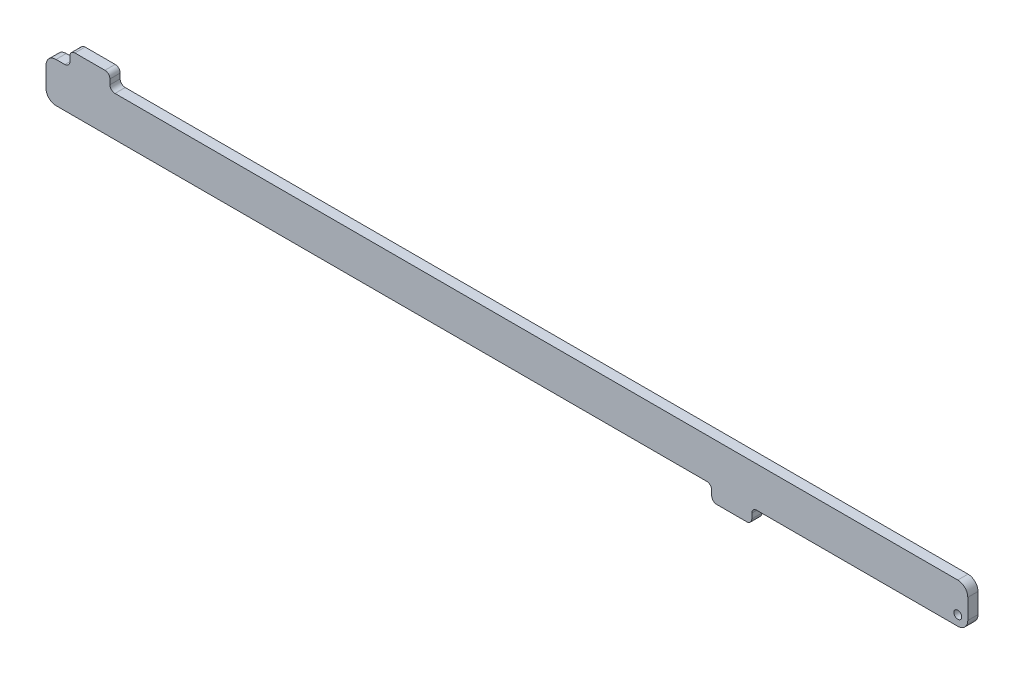
ISO-10303-21;
HEADER;
FILE_DESCRIPTION(('STEP AP214'),'2;1');
FILE_NAME('part.step','',(''),(''),'','','');
FILE_SCHEMA(('AUTOMOTIVE_DESIGN { 1 0 10303 214 1 1 1 1 }'));
ENDSEC;
DATA;
#1=APPLICATION_CONTEXT('core data for automotive mechanical design processes');
#2=APPLICATION_PROTOCOL_DEFINITION('international standard','automotive_design',2000,#1);
#3=PRODUCT_CONTEXT('',#1,'mechanical');
#4=PRODUCT('Part','Part','',(#3));
#5=PRODUCT_RELATED_PRODUCT_CATEGORY('part','',(#4));
#6=PRODUCT_DEFINITION_FORMATION('','',#4);
#7=PRODUCT_DEFINITION_CONTEXT('part definition',#1,'design');
#8=PRODUCT_DEFINITION('design','',#6,#7);
#9=PRODUCT_DEFINITION_SHAPE('','',#8);
#10=(LENGTH_UNIT() NAMED_UNIT(*) SI_UNIT(.MILLI.,.METRE.));
#11=(NAMED_UNIT(*) PLANE_ANGLE_UNIT() SI_UNIT($,.RADIAN.));
#12=(NAMED_UNIT(*) SI_UNIT($,.STERADIAN.) SOLID_ANGLE_UNIT());
#13=UNCERTAINTY_MEASURE_WITH_UNIT(LENGTH_MEASURE(1.E-05),#10,'distance_accuracy_value','');
#14=(GEOMETRIC_REPRESENTATION_CONTEXT(3) GLOBAL_UNCERTAINTY_ASSIGNED_CONTEXT((#13)) GLOBAL_UNIT_ASSIGNED_CONTEXT((#10,
#11,#12)) REPRESENTATION_CONTEXT('',''));
#15=CARTESIAN_POINT('',(0.,0.,0.));
#16=DIRECTION('',(0.,0.,1.));
#17=DIRECTION('',(1.,0.,0.));
#18=AXIS2_PLACEMENT_3D('',#15,#16,#17);
#19=CARTESIAN_POINT('',(447.303292844,0.,-6.477));
#20=DIRECTION('',(-1.,0.,0.));
#21=DIRECTION('',(0.,0.,-1.));
#22=AXIS2_PLACEMENT_3D('',#19,#20,#21);
#23=PLANE('',#22);
#24=DIRECTION('',(0.,1.,0.));
#25=VECTOR('',#24,1.);
#26=CARTESIAN_POINT('',(447.303292844,0.,-6.477));
#27=LINE('',#26,#25);
#28=CARTESIAN_POINT('',(447.303292844,-6.35,-6.477));
#29=VERTEX_POINT('',#28);
#30=CARTESIAN_POINT('',(447.303292844,-3.175,-6.477));
#31=VERTEX_POINT('',#30);
#32=EDGE_CURVE('E485',#29,#31,#27,.T.);
#33=ORIENTED_EDGE('',*,*,#32,.T.);
#34=DIRECTION('',(0.,0.,1.));
#35=VECTOR('',#34,1.);
#36=CARTESIAN_POINT('',(447.303292844,-3.175,0.));
#37=LINE('',#36,#35);
#38=CARTESIAN_POINT('',(447.303292844,-3.175,0.));
#39=VERTEX_POINT('',#38);
#40=EDGE_CURVE('E329',#31,#39,#37,.T.);
#41=ORIENTED_EDGE('',*,*,#40,.T.);
#42=DIRECTION('',(0.,1.,0.));
#43=VECTOR('',#42,1.);
#44=CARTESIAN_POINT('',(447.303292844,0.,0.));
#45=LINE('',#44,#43);
#46=CARTESIAN_POINT('',(447.303292844,-6.35,0.));
#47=VERTEX_POINT('',#46);
#48=EDGE_CURVE('E248',#47,#39,#45,.T.);
#49=ORIENTED_EDGE('',*,*,#48,.F.);
#50=DIRECTION('',(0.,0.,1.));
#51=VECTOR('',#50,1.);
#52=CARTESIAN_POINT('',(447.303292844,-6.35,-6.477));
#53=LINE('',#52,#51);
#54=EDGE_CURVE('E326',#47,#29,#53,.F.);
#55=ORIENTED_EDGE('',*,*,#54,.T.);
#56=EDGE_LOOP('',(#33,#41,#49,#55));
#57=FACE_BOUND('',#56,.T.);
#58=ADVANCED_FACE('F47',(#57),#23,.F.);
#59=CARTESIAN_POINT('',(0.,0.,-6.477));
#60=DIRECTION('',(0.,1.,0.));
#61=DIRECTION('',(0.,0.,-1.));
#62=AXIS2_PLACEMENT_3D('',#59,#60,#61);
#63=PLANE('',#62);
#64=DIRECTION('',(1.,0.,0.));
#65=VECTOR('',#64,1.);
#66=CARTESIAN_POINT('',(0.,0.,0.));
#67=LINE('',#66,#65);
#68=CARTESIAN_POINT('',(450.478292844,0.,0.));
#69=VERTEX_POINT('',#68);
#70=CARTESIAN_POINT('',(577.85,0.,0.));
#71=VERTEX_POINT('',#70);
#72=EDGE_CURVE('E219',#69,#71,#67,.T.);
#73=ORIENTED_EDGE('',*,*,#72,.F.);
#74=DIRECTION('',(0.,0.,1.));
#75=VECTOR('',#74,1.);
#76=CARTESIAN_POINT('',(450.478292844,0.,-6.477));
#77=LINE('',#76,#75);
#78=CARTESIAN_POINT('',(450.478292844,0.,-6.477));
#79=VERTEX_POINT('',#78);
#80=EDGE_CURVE('E333',#69,#79,#77,.F.);
#81=ORIENTED_EDGE('',*,*,#80,.T.);
#82=DIRECTION('',(1.,0.,0.));
#83=VECTOR('',#82,1.);
#84=CARTESIAN_POINT('',(0.,0.,-6.477));
#85=LINE('',#84,#83);
#86=CARTESIAN_POINT('',(577.85,0.,-6.477));
#87=VERTEX_POINT('',#86);
#88=EDGE_CURVE('E590',#79,#87,#85,.T.);
#89=ORIENTED_EDGE('',*,*,#88,.T.);
#90=DIRECTION('',(0.,0.,1.));
#91=VECTOR('',#90,1.);
#92=CARTESIAN_POINT('',(577.85,0.,-6.477));
#93=LINE('',#92,#91);
#94=EDGE_CURVE('E224',#71,#87,#93,.F.);
#95=ORIENTED_EDGE('',*,*,#94,.F.);
#96=EDGE_LOOP('',(#73,#81,#89,#95));
#97=FACE_BOUND('',#96,.T.);
#98=ADVANCED_FACE('F529',(#97),#63,.F.);
#99=CARTESIAN_POINT('',(584.2,0.,-6.477));
#100=DIRECTION('',(-1.,0.,0.));
#101=DIRECTION('',(0.,0.,-1.));
#102=AXIS2_PLACEMENT_3D('',#99,#100,#101);
#103=PLANE('',#102);
#104=DIRECTION('',(0.,1.,0.));
#105=VECTOR('',#104,1.);
#106=CARTESIAN_POINT('',(584.2,0.,-6.477));
#107=LINE('',#106,#105);
#108=CARTESIAN_POINT('',(584.2,6.35,-6.477));
#109=VERTEX_POINT('',#108);
#110=CARTESIAN_POINT('',(584.2,19.05,-6.477));
#111=VERTEX_POINT('',#110);
#112=EDGE_CURVE('E585',#109,#111,#107,.T.);
#113=ORIENTED_EDGE('',*,*,#112,.T.);
#114=DIRECTION('',(0.,0.,1.));
#115=VECTOR('',#114,1.);
#116=CARTESIAN_POINT('',(584.2,19.05,-6.477));
#117=LINE('',#116,#115);
#118=CARTESIAN_POINT('',(584.2,19.05,0.));
#119=VERTEX_POINT('',#118);
#120=EDGE_CURVE('E237',#119,#111,#117,.F.);
#121=ORIENTED_EDGE('',*,*,#120,.F.);
#122=DIRECTION('',(0.,1.,0.));
#123=VECTOR('',#122,1.);
#124=CARTESIAN_POINT('',(584.2,0.,0.));
#125=LINE('',#124,#123);
#126=CARTESIAN_POINT('',(584.2,6.35,0.));
#127=VERTEX_POINT('',#126);
#128=EDGE_CURVE('E216',#127,#119,#125,.T.);
#129=ORIENTED_EDGE('',*,*,#128,.F.);
#130=DIRECTION('',(0.,0.,1.));
#131=VECTOR('',#130,1.);
#132=CARTESIAN_POINT('',(584.2,6.35,-6.477));
#133=LINE('',#132,#131);
#134=EDGE_CURVE('E228',#109,#127,#133,.T.);
#135=ORIENTED_EDGE('',*,*,#134,.F.);
#136=EDGE_LOOP('',(#113,#121,#129,#135));
#137=FACE_BOUND('',#136,.T.);
#138=ADVANCED_FACE('F239',(#137),#103,.F.);
#139=CARTESIAN_POINT('',(0.,25.4,-6.477));
#140=DIRECTION('',(0.,1.,0.));
#141=DIRECTION('',(0.,0.,-1.));
#142=AXIS2_PLACEMENT_3D('',#139,#140,#141);
#143=PLANE('',#142);
#144=DIRECTION('',(1.,0.,0.));
#145=VECTOR('',#144,1.);
#146=CARTESIAN_POINT('',(0.,25.4,-6.477));
#147=LINE('',#146,#145);
#148=CARTESIAN_POINT('',(43.705665192,25.4,-6.477));
#149=VERTEX_POINT('',#148);
#150=CARTESIAN_POINT('',(577.85,25.4,-6.477));
#151=VERTEX_POINT('',#150);
#152=EDGE_CURVE('E551',#149,#151,#147,.T.);
#153=ORIENTED_EDGE('',*,*,#152,.F.);
#154=DIRECTION('',(0.,0.,1.));
#155=VECTOR('',#154,1.);
#156=CARTESIAN_POINT('',(43.705665192,25.4,0.));
#157=LINE('',#156,#155);
#158=CARTESIAN_POINT('',(43.705665192,25.4,0.));
#159=VERTEX_POINT('',#158);
#160=EDGE_CURVE('E378',#149,#159,#157,.T.);
#161=ORIENTED_EDGE('',*,*,#160,.T.);
#162=DIRECTION('',(1.,0.,0.));
#163=VECTOR('',#162,1.);
#164=CARTESIAN_POINT('',(0.,25.4,0.));
#165=LINE('',#164,#163);
#166=CARTESIAN_POINT('',(577.85,25.4,0.));
#167=VERTEX_POINT('',#166);
#168=EDGE_CURVE('E242',#159,#167,#165,.T.);
#169=ORIENTED_EDGE('',*,*,#168,.T.);
#170=DIRECTION('',(0.,0.,1.));
#171=VECTOR('',#170,1.);
#172=CARTESIAN_POINT('',(577.85,25.4,0.));
#173=LINE('',#172,#171);
#174=EDGE_CURVE('E306',#151,#167,#173,.T.);
#175=ORIENTED_EDGE('',*,*,#174,.F.);
#176=EDGE_LOOP('',(#153,#161,#169,#175));
#177=FACE_BOUND('',#176,.T.);
#178=ADVANCED_FACE('F550',(#177),#143,.T.);
#179=CARTESIAN_POINT('',(40.530665192,0.,-6.477));
#180=DIRECTION('',(1.,0.,0.));
#181=DIRECTION('',(0.,0.,1.));
#182=AXIS2_PLACEMENT_3D('',#179,#180,#181);
#183=PLANE('',#182);
#184=DIRECTION('',(0.,-1.,0.));
#185=VECTOR('',#184,1.);
#186=CARTESIAN_POINT('',(40.530665192,0.,0.));
#187=LINE('',#186,#185);
#188=CARTESIAN_POINT('',(40.530665192,31.75,0.));
#189=VERTEX_POINT('',#188);
#190=CARTESIAN_POINT('',(40.530665192,28.575,0.));
#191=VERTEX_POINT('',#190);
#192=EDGE_CURVE('E246',#189,#191,#187,.T.);
#193=ORIENTED_EDGE('',*,*,#192,.T.);
#194=DIRECTION('',(0.,0.,1.));
#195=VECTOR('',#194,1.);
#196=CARTESIAN_POINT('',(40.530665192,28.575,-6.477));
#197=LINE('',#196,#195);
#198=CARTESIAN_POINT('',(40.530665192,28.575,-6.477));
#199=VERTEX_POINT('',#198);
#200=EDGE_CURVE('E71',#191,#199,#197,.F.);
#201=ORIENTED_EDGE('',*,*,#200,.T.);
#202=DIRECTION('',(0.,-1.,0.));
#203=VECTOR('',#202,1.);
#204=CARTESIAN_POINT('',(40.530665192,0.,-6.477));
#205=LINE('',#204,#203);
#206=CARTESIAN_POINT('',(40.530665192,31.75,-6.477));
#207=VERTEX_POINT('',#206);
#208=EDGE_CURVE('E451',#207,#199,#205,.T.);
#209=ORIENTED_EDGE('',*,*,#208,.F.);
#210=DIRECTION('',(0.,0.,1.));
#211=VECTOR('',#210,1.);
#212=CARTESIAN_POINT('',(40.530665192,31.75,-6.477));
#213=LINE('',#212,#211);
#214=EDGE_CURVE('E382',#207,#189,#213,.T.);
#215=ORIENTED_EDGE('',*,*,#214,.T.);
#216=EDGE_LOOP('',(#193,#201,#209,#215));
#217=FACE_BOUND('',#216,.T.);
#218=ADVANCED_FACE('F556',(#217),#183,.T.);
#219=CARTESIAN_POINT('',(0.,34.925,-6.477));
#220=DIRECTION('',(0.,1.,0.));
#221=DIRECTION('',(0.,0.,-1.));
#222=AXIS2_PLACEMENT_3D('',#219,#220,#221);
#223=PLANE('',#222);
#224=DIRECTION('',(1.,0.,0.));
#225=VECTOR('',#224,1.);
#226=CARTESIAN_POINT('',(0.,34.925,0.));
#227=LINE('',#226,#225);
#228=CARTESIAN_POINT('',(18.305665192,34.925,0.));
#229=VERTEX_POINT('',#228);
#230=CARTESIAN_POINT('',(37.355665192,34.925,0.));
#231=VERTEX_POINT('',#230);
#232=EDGE_CURVE('E254',#229,#231,#227,.T.);
#233=ORIENTED_EDGE('',*,*,#232,.T.);
#234=DIRECTION('',(0.,0.,1.));
#235=VECTOR('',#234,1.);
#236=CARTESIAN_POINT('',(37.355665192,34.925,-6.477));
#237=LINE('',#236,#235);
#238=CARTESIAN_POINT('',(37.355665192,34.925,-6.477));
#239=VERTEX_POINT('',#238);
#240=EDGE_CURVE('E392',#231,#239,#237,.F.);
#241=ORIENTED_EDGE('',*,*,#240,.T.);
#242=DIRECTION('',(1.,0.,0.));
#243=VECTOR('',#242,1.);
#244=CARTESIAN_POINT('',(0.,34.925,-6.477));
#245=LINE('',#244,#243);
#246=CARTESIAN_POINT('',(18.305665192,34.925,-6.477));
#247=VERTEX_POINT('',#246);
#248=EDGE_CURVE('E444',#247,#239,#245,.T.);
#249=ORIENTED_EDGE('',*,*,#248,.F.);
#250=DIRECTION('',(0.,0.,1.));
#251=VECTOR('',#250,1.);
#252=CARTESIAN_POINT('',(18.305665192,34.925,0.));
#253=LINE('',#252,#251);
#254=EDGE_CURVE('E388',#247,#229,#253,.T.);
#255=ORIENTED_EDGE('',*,*,#254,.T.);
#256=EDGE_LOOP('',(#233,#241,#249,#255));
#257=FACE_BOUND('',#256,.T.);
#258=ADVANCED_FACE('F580',(#257),#223,.T.);
#259=CARTESIAN_POINT('',(15.130665192,0.,-6.477));
#260=DIRECTION('',(1.,0.,0.));
#261=DIRECTION('',(0.,0.,1.));
#262=AXIS2_PLACEMENT_3D('',#259,#260,#261);
#263=PLANE('',#262);
#264=DIRECTION('',(0.,-1.,0.));
#265=VECTOR('',#264,1.);
#266=CARTESIAN_POINT('',(15.130665192,0.,0.));
#267=LINE('',#266,#265);
#268=CARTESIAN_POINT('',(15.130665192,31.75,0.));
#269=VERTEX_POINT('',#268);
#270=CARTESIAN_POINT('',(15.130665192,28.575,0.));
#271=VERTEX_POINT('',#270);
#272=EDGE_CURVE('E258',#269,#271,#267,.T.);
#273=ORIENTED_EDGE('',*,*,#272,.F.);
#274=DIRECTION('',(0.,0.,1.));
#275=VECTOR('',#274,1.);
#276=CARTESIAN_POINT('',(15.130665192,31.75,-6.477));
#277=LINE('',#276,#275);
#278=CARTESIAN_POINT('',(15.130665192,31.75,-6.477));
#279=VERTEX_POINT('',#278);
#280=EDGE_CURVE('E399',#269,#279,#277,.F.);
#281=ORIENTED_EDGE('',*,*,#280,.T.);
#282=DIRECTION('',(0.,-1.,0.));
#283=VECTOR('',#282,1.);
#284=CARTESIAN_POINT('',(15.130665192,0.,-6.477));
#285=LINE('',#284,#283);
#286=CARTESIAN_POINT('',(15.130665192,28.575,-6.477));
#287=VERTEX_POINT('',#286);
#288=EDGE_CURVE('E437',#279,#287,#285,.T.);
#289=ORIENTED_EDGE('',*,*,#288,.T.);
#290=DIRECTION('',(0.,0.,1.));
#291=VECTOR('',#290,1.);
#292=CARTESIAN_POINT('',(15.130665192,28.575,-6.477));
#293=LINE('',#292,#291);
#294=EDGE_CURVE('E395',#287,#271,#293,.T.);
#295=ORIENTED_EDGE('',*,*,#294,.T.);
#296=EDGE_LOOP('',(#273,#281,#289,#295));
#297=FACE_BOUND('',#296,.T.);
#298=ADVANCED_FACE('F441',(#297),#263,.F.);
#299=CARTESIAN_POINT('',(0.,25.4,-6.477));
#300=DIRECTION('',(0.,1.,0.));
#301=DIRECTION('',(0.,0.,-1.));
#302=AXIS2_PLACEMENT_3D('',#299,#300,#301);
#303=PLANE('',#302);
#304=DIRECTION('',(1.,0.,0.));
#305=VECTOR('',#304,1.);
#306=CARTESIAN_POINT('',(0.,25.4,0.));
#307=LINE('',#306,#305);
#308=CARTESIAN_POINT('',(6.35,25.4,0.));
#309=VERTEX_POINT('',#308);
#310=CARTESIAN_POINT('',(11.955665192,25.4,0.));
#311=VERTEX_POINT('',#310);
#312=EDGE_CURVE('E262',#309,#311,#307,.T.);
#313=ORIENTED_EDGE('',*,*,#312,.T.);
#314=DIRECTION('',(0.,0.,1.));
#315=VECTOR('',#314,1.);
#316=CARTESIAN_POINT('',(11.955665192,25.4,-6.477));
#317=LINE('',#316,#315);
#318=CARTESIAN_POINT('',(11.955665192,25.4,-6.477));
#319=VERTEX_POINT('',#318);
#320=EDGE_CURVE('E402',#311,#319,#317,.F.);
#321=ORIENTED_EDGE('',*,*,#320,.T.);
#322=DIRECTION('',(1.,0.,0.));
#323=VECTOR('',#322,1.);
#324=CARTESIAN_POINT('',(0.,25.4,-6.477));
#325=LINE('',#324,#323);
#326=CARTESIAN_POINT('',(6.35,25.4,-6.477));
#327=VERTEX_POINT('',#326);
#328=EDGE_CURVE('E439',#327,#319,#325,.T.);
#329=ORIENTED_EDGE('',*,*,#328,.F.);
#330=DIRECTION('',(0.,0.,1.));
#331=VECTOR('',#330,1.);
#332=CARTESIAN_POINT('',(6.35,25.4,-6.477));
#333=LINE('',#332,#331);
#334=EDGE_CURVE('E322',#309,#327,#333,.F.);
#335=ORIENTED_EDGE('',*,*,#334,.F.);
#336=EDGE_LOOP('',(#313,#321,#329,#335));
#337=FACE_BOUND('',#336,.T.);
#338=ADVANCED_FACE('F429',(#337),#303,.T.);
#339=CARTESIAN_POINT('',(0.,0.,-6.477));
#340=DIRECTION('',(-1.,0.,0.));
#341=DIRECTION('',(0.,0.,-1.));
#342=AXIS2_PLACEMENT_3D('',#339,#340,#341);
#343=PLANE('',#342);
#344=DIRECTION('',(0.,1.,0.));
#345=VECTOR('',#344,1.);
#346=CARTESIAN_POINT('',(0.,0.,0.));
#347=LINE('',#346,#345);
#348=CARTESIAN_POINT('',(0.,6.34999999999998,0.));
#349=VERTEX_POINT('',#348);
#350=CARTESIAN_POINT('',(0.,19.05,0.));
#351=VERTEX_POINT('',#350);
#352=EDGE_CURVE('E266',#349,#351,#347,.T.);
#353=ORIENTED_EDGE('',*,*,#352,.T.);
#354=DIRECTION('',(0.,0.,1.));
#355=VECTOR('',#354,1.);
#356=CARTESIAN_POINT('',(0.,19.05,-6.477));
#357=LINE('',#356,#355);
#358=CARTESIAN_POINT('',(0.,19.05,-6.477));
#359=VERTEX_POINT('',#358);
#360=EDGE_CURVE('E314',#359,#351,#357,.T.);
#361=ORIENTED_EDGE('',*,*,#360,.F.);
#362=DIRECTION('',(0.,1.,0.));
#363=VECTOR('',#362,1.);
#364=CARTESIAN_POINT('',(0.,0.,-6.477));
#365=LINE('',#364,#363);
#366=CARTESIAN_POINT('',(0.,6.34999999999998,-6.477));
#367=VERTEX_POINT('',#366);
#368=EDGE_CURVE('E448',#367,#359,#365,.T.);
#369=ORIENTED_EDGE('',*,*,#368,.F.);
#370=DIRECTION('',(0.,0.,1.));
#371=VECTOR('',#370,1.);
#372=CARTESIAN_POINT('',(0.,6.34999999999998,-6.477));
#373=LINE('',#372,#371);
#374=EDGE_CURVE('E318',#349,#367,#373,.F.);
#375=ORIENTED_EDGE('',*,*,#374,.F.);
#376=EDGE_LOOP('',(#353,#361,#369,#375));
#377=FACE_BOUND('',#376,.T.);
#378=ADVANCED_FACE('F513',(#377),#343,.T.);
#379=CARTESIAN_POINT('',(0.,0.,-6.477));
#380=DIRECTION('',(0.,1.,0.));
#381=DIRECTION('',(-1.,0.,0.));
#382=AXIS2_PLACEMENT_3D('',#379,#380,#381);
#383=PLANE('',#382);
#384=DIRECTION('',(1.,0.,0.));
#385=VECTOR('',#384,1.);
#386=CARTESIAN_POINT('',(0.,0.,-6.477));
#387=LINE('',#386,#385);
#388=CARTESIAN_POINT('',(6.34999999999998,0.,-6.477));
#389=VERTEX_POINT('',#388);
#390=CARTESIAN_POINT('',(418.728292844,-1.03945476449815E-12,-6.477));
#391=VERTEX_POINT('',#390);
#392=EDGE_CURVE('E458',#389,#391,#387,.T.);
#393=ORIENTED_EDGE('',*,*,#392,.T.);
#394=DIRECTION('',(0.,0.,1.));
#395=VECTOR('',#394,1.);
#396=CARTESIAN_POINT('',(418.728292844,-1.03945476449815E-12,0.));
#397=LINE('',#396,#395);
#398=CARTESIAN_POINT('',(418.728292844,-1.03945476449815E-12,0.));
#399=VERTEX_POINT('',#398);
#400=EDGE_CURVE('E374',#391,#399,#397,.T.);
#401=ORIENTED_EDGE('',*,*,#400,.T.);
#402=DIRECTION('',(1.,0.,0.));
#403=VECTOR('',#402,1.);
#404=CARTESIAN_POINT('',(0.,0.,0.));
#405=LINE('',#404,#403);
#406=CARTESIAN_POINT('',(6.34999999999998,0.,0.));
#407=VERTEX_POINT('',#406);
#408=EDGE_CURVE('E270',#407,#399,#405,.T.);
#409=ORIENTED_EDGE('',*,*,#408,.F.);
#410=DIRECTION('',(0.,0.,1.));
#411=VECTOR('',#410,1.);
#412=CARTESIAN_POINT('',(6.34999999999998,0.,0.));
#413=LINE('',#412,#411);
#414=EDGE_CURVE('E310',#389,#407,#413,.T.);
#415=ORIENTED_EDGE('',*,*,#414,.F.);
#416=EDGE_LOOP('',(#393,#401,#409,#415));
#417=FACE_BOUND('',#416,.T.);
#418=ADVANCED_FACE('F505',(#417),#383,.F.);
#419=CARTESIAN_POINT('',(421.903292844,2.45882808336262E-12,-6.477));
#420=DIRECTION('',(1.,0.,0.));
#421=DIRECTION('',(0.,1.,0.));
#422=AXIS2_PLACEMENT_3D('',#419,#420,#421);
#423=PLANE('',#422);
#424=DIRECTION('',(0.,-1.,0.));
#425=VECTOR('',#424,1.);
#426=CARTESIAN_POINT('',(421.903292844,2.45882808336262E-12,-6.477));
#427=LINE('',#426,#425);
#428=CARTESIAN_POINT('',(421.903292844,-3.17500000000102,-6.477));
#429=VERTEX_POINT('',#428);
#430=CARTESIAN_POINT('',(421.903292844,-6.35000000000002,-6.477));
#431=VERTEX_POINT('',#430);
#432=EDGE_CURVE('E462',#429,#431,#427,.T.);
#433=ORIENTED_EDGE('',*,*,#432,.T.);
#434=DIRECTION('',(0.,0.,1.));
#435=VECTOR('',#434,1.);
#436=CARTESIAN_POINT('',(421.903292844,-6.35000000000002,-6.477));
#437=LINE('',#436,#435);
#438=CARTESIAN_POINT('',(421.903292844,-6.35000000000002,0.));
#439=VERTEX_POINT('',#438);
#440=EDGE_CURVE('E370',#431,#439,#437,.T.);
#441=ORIENTED_EDGE('',*,*,#440,.T.);
#442=DIRECTION('',(0.,-1.,0.));
#443=VECTOR('',#442,1.);
#444=CARTESIAN_POINT('',(421.903292844,2.45882808336262E-12,0.));
#445=LINE('',#444,#443);
#446=CARTESIAN_POINT('',(421.903292844,-3.17500000000102,0.));
#447=VERTEX_POINT('',#446);
#448=EDGE_CURVE('E274',#447,#439,#445,.T.);
#449=ORIENTED_EDGE('',*,*,#448,.F.);
#450=DIRECTION('',(0.,0.,1.));
#451=VECTOR('',#450,1.);
#452=CARTESIAN_POINT('',(421.903292844,-3.17500000000102,-6.477));
#453=LINE('',#452,#451);
#454=EDGE_CURVE('E367',#447,#429,#453,.F.);
#455=ORIENTED_EDGE('',*,*,#454,.T.);
#456=EDGE_LOOP('',(#433,#441,#449,#455));
#457=FACE_BOUND('',#456,.T.);
#458=ADVANCED_FACE('F496',(#457),#423,.F.);
#459=CARTESIAN_POINT('',(577.85,6.35,-6.477));
#460=DIRECTION('',(0.,0.,1.));
#461=DIRECTION('',(-1.,0.,0.));
#462=AXIS2_PLACEMENT_3D('',#459,#460,#461);
#463=CYLINDRICAL_SURFACE('',#462,2.48919999999995);
#464=CARTESIAN_POINT('',(577.85,6.35,-6.477));
#465=DIRECTION('',(0.,0.,1.));
#466=DIRECTION('',(1.,0.,0.));
#467=AXIS2_PLACEMENT_3D('',#464,#465,#466);
#468=CIRCLE('',#467,2.48919999999995);
#469=CARTESIAN_POINT('',(580.3392,6.35,-6.477));
#470=VERTEX_POINT('',#469);
#471=EDGE_CURVE('E281',#470,#470,#468,.T.);
#472=ORIENTED_EDGE('',*,*,#471,.F.);
#473=EDGE_LOOP('',(#472));
#474=FACE_BOUND('',#473,.T.);
#475=CARTESIAN_POINT('',(577.85,6.35,0.));
#476=DIRECTION('',(0.,0.,1.));
#477=DIRECTION('',(1.,0.,0.));
#478=AXIS2_PLACEMENT_3D('',#475,#476,#477);
#479=CIRCLE('',#478,2.48919999999995);
#480=CARTESIAN_POINT('',(580.3392,6.35,0.));
#481=VERTEX_POINT('',#480);
#482=EDGE_CURVE('E469',#481,#481,#479,.T.);
#483=ORIENTED_EDGE('',*,*,#482,.T.);
#484=EDGE_LOOP('',(#483));
#485=FACE_BOUND('',#484,.T.);
#486=ADVANCED_FACE('F538',(#474,#485),#463,.F.);
#487=CARTESIAN_POINT('',(0.,-9.525,-6.477));
#488=DIRECTION('',(0.,1.,0.));
#489=DIRECTION('',(0.,0.,-1.));
#490=AXIS2_PLACEMENT_3D('',#487,#488,#489);
#491=PLANE('',#490);
#492=DIRECTION('',(1.,0.,0.));
#493=VECTOR('',#492,1.);
#494=CARTESIAN_POINT('',(0.,-9.525,-6.477));
#495=LINE('',#494,#493);
#496=CARTESIAN_POINT('',(425.078292844,-9.525,-6.477));
#497=VERTEX_POINT('',#496);
#498=CARTESIAN_POINT('',(444.128292844,-9.525,-6.477));
#499=VERTEX_POINT('',#498);
#500=EDGE_CURVE('E283',#497,#499,#495,.T.);
#501=ORIENTED_EDGE('',*,*,#500,.T.);
#502=DIRECTION('',(0.,0.,1.));
#503=VECTOR('',#502,1.);
#504=CARTESIAN_POINT('',(444.128292844,-9.525,-6.477));
#505=LINE('',#504,#503);
#506=CARTESIAN_POINT('',(444.128292844,-9.525,0.));
#507=VERTEX_POINT('',#506);
#508=EDGE_CURVE('E339',#499,#507,#505,.T.);
#509=ORIENTED_EDGE('',*,*,#508,.T.);
#510=DIRECTION('',(1.,0.,0.));
#511=VECTOR('',#510,1.);
#512=CARTESIAN_POINT('',(0.,-9.525,0.));
#513=LINE('',#512,#511);
#514=CARTESIAN_POINT('',(425.078292844,-9.525,0.));
#515=VERTEX_POINT('',#514);
#516=EDGE_CURVE('E278',#515,#507,#513,.T.);
#517=ORIENTED_EDGE('',*,*,#516,.F.);
#518=DIRECTION('',(0.,0.,1.));
#519=VECTOR('',#518,1.);
#520=CARTESIAN_POINT('',(425.078292844,-9.525,-6.477));
#521=LINE('',#520,#519);
#522=EDGE_CURVE('E336',#515,#497,#521,.F.);
#523=ORIENTED_EDGE('',*,*,#522,.T.);
#524=EDGE_LOOP('',(#501,#509,#517,#523));
#525=FACE_BOUND('',#524,.T.);
#526=ADVANCED_FACE('F487',(#525),#491,.F.);
#527=CARTESIAN_POINT('',(0.,0.,-6.477));
#528=DIRECTION('',(0.,0.,-1.));
#529=DIRECTION('',(1.,0.,0.));
#530=AXIS2_PLACEMENT_3D('',#527,#528,#529);
#531=PLANE('',#530);
#532=ORIENTED_EDGE('',*,*,#471,.T.);
#533=EDGE_LOOP('',(#532));
#534=FACE_BOUND('',#533,.T.);
#535=ORIENTED_EDGE('',*,*,#32,.F.);
#536=CARTESIAN_POINT('',(444.128292844,-6.35,-6.477));
#537=DIRECTION('',(0.,0.,-1.));
#538=DIRECTION('',(-1.,0.,0.));
#539=AXIS2_PLACEMENT_3D('',#536,#537,#538);
#540=CIRCLE('',#539,3.175);
#541=EDGE_CURVE('E364',#29,#499,#540,.T.);
#542=ORIENTED_EDGE('',*,*,#541,.T.);
#543=ORIENTED_EDGE('',*,*,#500,.F.);
#544=CARTESIAN_POINT('',(425.078292844,-6.35,-6.477));
#545=DIRECTION('',(0.,0.,-1.));
#546=DIRECTION('',(-1.,0.,0.));
#547=AXIS2_PLACEMENT_3D('',#544,#545,#546);
#548=CIRCLE('',#547,3.175);
#549=EDGE_CURVE('E361',#497,#431,#548,.T.);
#550=ORIENTED_EDGE('',*,*,#549,.T.);
#551=ORIENTED_EDGE('',*,*,#432,.F.);
#552=CARTESIAN_POINT('',(418.728292844,-3.17500000000104,-6.477));
#553=DIRECTION('',(0.,0.,-1.));
#554=DIRECTION('',(-1.,0.,0.));
#555=AXIS2_PLACEMENT_3D('',#552,#553,#554);
#556=CIRCLE('',#555,3.175);
#557=EDGE_CURVE('E414',#429,#391,#556,.F.);
#558=ORIENTED_EDGE('',*,*,#557,.T.);
#559=ORIENTED_EDGE('',*,*,#392,.F.);
#560=CARTESIAN_POINT('',(6.35,6.34999999999998,-6.477));
#561=DIRECTION('',(0.,0.,1.));
#562=DIRECTION('',(1.,0.,0.));
#563=AXIS2_PLACEMENT_3D('',#560,#561,#562);
#564=CIRCLE('',#563,6.35);
#565=EDGE_CURVE('E297',#367,#389,#564,.T.);
#566=ORIENTED_EDGE('',*,*,#565,.F.);
#567=ORIENTED_EDGE('',*,*,#368,.T.);
#568=CARTESIAN_POINT('',(6.35,19.05,-6.477));
#569=DIRECTION('',(0.,0.,1.));
#570=DIRECTION('',(1.,0.,0.));
#571=AXIS2_PLACEMENT_3D('',#568,#569,#570);
#572=CIRCLE('',#571,6.35);
#573=EDGE_CURVE('E294',#327,#359,#572,.T.);
#574=ORIENTED_EDGE('',*,*,#573,.F.);
#575=ORIENTED_EDGE('',*,*,#328,.T.);
#576=CARTESIAN_POINT('',(11.955665192,28.575,-6.477));
#577=DIRECTION('',(0.,0.,-1.));
#578=DIRECTION('',(-1.,0.,0.));
#579=AXIS2_PLACEMENT_3D('',#576,#577,#578);
#580=CIRCLE('',#579,3.175);
#581=EDGE_CURVE('E11',#319,#287,#580,.F.);
#582=ORIENTED_EDGE('',*,*,#581,.T.);
#583=ORIENTED_EDGE('',*,*,#288,.F.);
#584=CARTESIAN_POINT('',(18.305665192,31.75,-6.477));
#585=DIRECTION('',(0.,0.,-1.));
#586=DIRECTION('',(-1.,0.,0.));
#587=AXIS2_PLACEMENT_3D('',#584,#585,#586);
#588=CIRCLE('',#587,3.175);
#589=EDGE_CURVE('E355',#279,#247,#588,.T.);
#590=ORIENTED_EDGE('',*,*,#589,.T.);
#591=ORIENTED_EDGE('',*,*,#248,.T.);
#592=CARTESIAN_POINT('',(37.355665192,31.75,-6.477));
#593=DIRECTION('',(0.,0.,-1.));
#594=DIRECTION('',(-1.,0.,0.));
#595=AXIS2_PLACEMENT_3D('',#592,#593,#594);
#596=CIRCLE('',#595,3.175);
#597=EDGE_CURVE('E358',#239,#207,#596,.T.);
#598=ORIENTED_EDGE('',*,*,#597,.T.);
#599=ORIENTED_EDGE('',*,*,#208,.T.);
#600=CARTESIAN_POINT('',(43.705665192,28.575,-6.477));
#601=DIRECTION('',(0.,0.,-1.));
#602=DIRECTION('',(-1.,0.,0.));
#603=AXIS2_PLACEMENT_3D('',#600,#601,#602);
#604=CIRCLE('',#603,3.175);
#605=EDGE_CURVE('E63',#199,#149,#604,.F.);
#606=ORIENTED_EDGE('',*,*,#605,.T.);
#607=ORIENTED_EDGE('',*,*,#152,.T.);
#608=CARTESIAN_POINT('',(577.85,19.05,-6.477));
#609=DIRECTION('',(0.,0.,1.));
#610=DIRECTION('',(1.,0.,0.));
#611=AXIS2_PLACEMENT_3D('',#608,#609,#610);
#612=CIRCLE('',#611,6.35);
#613=EDGE_CURVE('E300',#111,#151,#612,.T.);
#614=ORIENTED_EDGE('',*,*,#613,.F.);
#615=ORIENTED_EDGE('',*,*,#112,.F.);
#616=CARTESIAN_POINT('',(577.85,6.35,-6.477));
#617=DIRECTION('',(0.,0.,1.));
#618=DIRECTION('',(1.,0.,0.));
#619=AXIS2_PLACEMENT_3D('',#616,#617,#618);
#620=CIRCLE('',#619,6.35);
#621=EDGE_CURVE('E231',#87,#109,#620,.T.);
#622=ORIENTED_EDGE('',*,*,#621,.F.);
#623=ORIENTED_EDGE('',*,*,#88,.F.);
#624=CARTESIAN_POINT('',(450.478292844,-3.175,-6.477));
#625=DIRECTION('',(0.,0.,-1.));
#626=DIRECTION('',(-1.,0.,0.));
#627=AXIS2_PLACEMENT_3D('',#624,#625,#626);
#628=CIRCLE('',#627,3.175);
#629=EDGE_CURVE('E408',#79,#31,#628,.F.);
#630=ORIENTED_EDGE('',*,*,#629,.T.);
#631=EDGE_LOOP('',(#535,#542,#543,#550,#551,#558,#559,#566,#567,#574,#575,#582,#583,#590,#591,
#598,#599,#606,#607,#614,#615,#622,#623,#630));
#632=FACE_BOUND('',#631,.T.);
#633=ADVANCED_FACE('F436',(#534,#632),#531,.T.);
#634=CARTESIAN_POINT('',(0.,0.,0.));
#635=DIRECTION('',(0.,0.,-1.));
#636=DIRECTION('',(1.,0.,0.));
#637=AXIS2_PLACEMENT_3D('',#634,#635,#636);
#638=PLANE('',#637);
#639=ORIENTED_EDGE('',*,*,#482,.F.);
#640=EDGE_LOOP('',(#639));
#641=FACE_BOUND('',#640,.T.);
#642=ORIENTED_EDGE('',*,*,#516,.T.);
#643=CARTESIAN_POINT('',(444.128292844,-6.35,0.));
#644=DIRECTION('',(0.,0.,-1.));
#645=DIRECTION('',(-1.,0.,0.));
#646=AXIS2_PLACEMENT_3D('',#643,#644,#645);
#647=CIRCLE('',#646,3.175);
#648=EDGE_CURVE('E352',#507,#47,#647,.F.);
#649=ORIENTED_EDGE('',*,*,#648,.T.);
#650=ORIENTED_EDGE('',*,*,#48,.T.);
#651=CARTESIAN_POINT('',(450.478292844,-3.175,0.));
#652=DIRECTION('',(0.,0.,-1.));
#653=DIRECTION('',(-1.,0.,0.));
#654=AXIS2_PLACEMENT_3D('',#651,#652,#653);
#655=CIRCLE('',#654,3.175);
#656=EDGE_CURVE('E405',#39,#69,#655,.T.);
#657=ORIENTED_EDGE('',*,*,#656,.T.);
#658=ORIENTED_EDGE('',*,*,#72,.T.);
#659=CARTESIAN_POINT('',(577.85,6.35,0.));
#660=DIRECTION('',(0.,0.,1.));
#661=DIRECTION('',(1.,0.,0.));
#662=AXIS2_PLACEMENT_3D('',#659,#660,#661);
#663=CIRCLE('',#662,6.35);
#664=EDGE_CURVE('E210',#127,#71,#663,.F.);
#665=ORIENTED_EDGE('',*,*,#664,.F.);
#666=ORIENTED_EDGE('',*,*,#128,.T.);
#667=CARTESIAN_POINT('',(577.85,19.05,0.));
#668=DIRECTION('',(0.,0.,1.));
#669=DIRECTION('',(1.,0.,0.));
#670=AXIS2_PLACEMENT_3D('',#667,#668,#669);
#671=CIRCLE('',#670,6.35);
#672=EDGE_CURVE('E225',#167,#119,#671,.F.);
#673=ORIENTED_EDGE('',*,*,#672,.F.);
#674=ORIENTED_EDGE('',*,*,#168,.F.);
#675=CARTESIAN_POINT('',(43.705665192,28.575,0.));
#676=DIRECTION('',(0.,0.,-1.));
#677=DIRECTION('',(-1.,0.,0.));
#678=AXIS2_PLACEMENT_3D('',#675,#676,#677);
#679=CIRCLE('',#678,3.175);
#680=EDGE_CURVE('E417',#159,#191,#679,.T.);
#681=ORIENTED_EDGE('',*,*,#680,.T.);
#682=ORIENTED_EDGE('',*,*,#192,.F.);
#683=CARTESIAN_POINT('',(37.355665192,31.75,0.));
#684=DIRECTION('',(0.,0.,-1.));
#685=DIRECTION('',(-1.,0.,0.));
#686=AXIS2_PLACEMENT_3D('',#683,#684,#685);
#687=CIRCLE('',#686,3.175);
#688=EDGE_CURVE('E346',#189,#231,#687,.F.);
#689=ORIENTED_EDGE('',*,*,#688,.T.);
#690=ORIENTED_EDGE('',*,*,#232,.F.);
#691=CARTESIAN_POINT('',(18.305665192,31.75,0.));
#692=DIRECTION('',(0.,0.,-1.));
#693=DIRECTION('',(-1.,0.,0.));
#694=AXIS2_PLACEMENT_3D('',#691,#692,#693);
#695=CIRCLE('',#694,3.175);
#696=EDGE_CURVE('E343',#229,#269,#695,.F.);
#697=ORIENTED_EDGE('',*,*,#696,.T.);
#698=ORIENTED_EDGE('',*,*,#272,.T.);
#699=CARTESIAN_POINT('',(11.955665192,28.575,0.));
#700=DIRECTION('',(0.,0.,-1.));
#701=DIRECTION('',(-1.,0.,0.));
#702=AXIS2_PLACEMENT_3D('',#699,#700,#701);
#703=CIRCLE('',#702,3.175);
#704=EDGE_CURVE('E56',#271,#311,#703,.T.);
#705=ORIENTED_EDGE('',*,*,#704,.T.);
#706=ORIENTED_EDGE('',*,*,#312,.F.);
#707=CARTESIAN_POINT('',(6.35,19.05,0.));
#708=DIRECTION('',(0.,0.,1.));
#709=DIRECTION('',(1.,0.,0.));
#710=AXIS2_PLACEMENT_3D('',#707,#708,#709);
#711=CIRCLE('',#710,6.35);
#712=EDGE_CURVE('E236',#351,#309,#711,.F.);
#713=ORIENTED_EDGE('',*,*,#712,.F.);
#714=ORIENTED_EDGE('',*,*,#352,.F.);
#715=CARTESIAN_POINT('',(6.35,6.34999999999998,0.));
#716=DIRECTION('',(0.,0.,1.));
#717=DIRECTION('',(1.,0.,0.));
#718=AXIS2_PLACEMENT_3D('',#715,#716,#717);
#719=CIRCLE('',#718,6.35);
#720=EDGE_CURVE('E287',#407,#349,#719,.F.);
#721=ORIENTED_EDGE('',*,*,#720,.F.);
#722=ORIENTED_EDGE('',*,*,#408,.T.);
#723=CARTESIAN_POINT('',(418.728292844,-3.17500000000104,0.));
#724=DIRECTION('',(0.,0.,-1.));
#725=DIRECTION('',(-1.,0.,0.));
#726=AXIS2_PLACEMENT_3D('',#723,#724,#725);
#727=CIRCLE('',#726,3.175);
#728=EDGE_CURVE('E411',#399,#447,#727,.T.);
#729=ORIENTED_EDGE('',*,*,#728,.T.);
#730=ORIENTED_EDGE('',*,*,#448,.T.);
#731=CARTESIAN_POINT('',(425.078292844,-6.35,0.));
#732=DIRECTION('',(0.,0.,-1.));
#733=DIRECTION('',(-1.,0.,0.));
#734=AXIS2_PLACEMENT_3D('',#731,#732,#733);
#735=CIRCLE('',#734,3.175);
#736=EDGE_CURVE('E349',#439,#515,#735,.F.);
#737=ORIENTED_EDGE('',*,*,#736,.T.);
#738=EDGE_LOOP('',(#642,#649,#650,#657,#658,#665,#666,#673,#674,#681,#682,#689,#690,#697,#698,
#705,#706,#713,#714,#721,#722,#729,#730,#737));
#739=FACE_BOUND('',#738,.T.);
#740=ADVANCED_FACE('F213',(#641,#739),#638,.F.);
#741=CARTESIAN_POINT('',(577.85,6.35,-6.477));
#742=DIRECTION('',(0.,0.,1.));
#743=DIRECTION('',(-1.,0.,0.));
#744=AXIS2_PLACEMENT_3D('',#741,#742,#743);
#745=CYLINDRICAL_SURFACE('',#744,6.35);
#746=ORIENTED_EDGE('',*,*,#621,.T.);
#747=ORIENTED_EDGE('',*,*,#134,.T.);
#748=ORIENTED_EDGE('',*,*,#664,.T.);
#749=ORIENTED_EDGE('',*,*,#94,.T.);
#750=EDGE_LOOP('',(#746,#747,#748,#749));
#751=FACE_BOUND('',#750,.T.);
#752=ADVANCED_FACE('F229',(#751),#745,.T.);
#753=CARTESIAN_POINT('',(577.85,19.05,-6.477));
#754=DIRECTION('',(0.,0.,-1.));
#755=DIRECTION('',(1.,0.,0.));
#756=AXIS2_PLACEMENT_3D('',#753,#754,#755);
#757=CYLINDRICAL_SURFACE('',#756,6.35);
#758=ORIENTED_EDGE('',*,*,#613,.T.);
#759=ORIENTED_EDGE('',*,*,#174,.T.);
#760=ORIENTED_EDGE('',*,*,#672,.T.);
#761=ORIENTED_EDGE('',*,*,#120,.T.);
#762=EDGE_LOOP('',(#758,#759,#760,#761));
#763=FACE_BOUND('',#762,.T.);
#764=ADVANCED_FACE('F526',(#763),#757,.T.);
#765=CARTESIAN_POINT('',(6.35,6.34999999999998,-6.477));
#766=DIRECTION('',(0.,0.,-1.));
#767=DIRECTION('',(1.,0.,0.));
#768=AXIS2_PLACEMENT_3D('',#765,#766,#767);
#769=CYLINDRICAL_SURFACE('',#768,6.35);
#770=ORIENTED_EDGE('',*,*,#565,.T.);
#771=ORIENTED_EDGE('',*,*,#414,.T.);
#772=ORIENTED_EDGE('',*,*,#720,.T.);
#773=ORIENTED_EDGE('',*,*,#374,.T.);
#774=EDGE_LOOP('',(#770,#771,#772,#773));
#775=FACE_BOUND('',#774,.T.);
#776=ADVANCED_FACE('F508',(#775),#769,.T.);
#777=CARTESIAN_POINT('',(6.35,19.05,-6.477));
#778=DIRECTION('',(0.,0.,1.));
#779=DIRECTION('',(-1.,0.,0.));
#780=AXIS2_PLACEMENT_3D('',#777,#778,#779);
#781=CYLINDRICAL_SURFACE('',#780,6.35);
#782=ORIENTED_EDGE('',*,*,#573,.T.);
#783=ORIENTED_EDGE('',*,*,#360,.T.);
#784=ORIENTED_EDGE('',*,*,#712,.T.);
#785=ORIENTED_EDGE('',*,*,#334,.T.);
#786=EDGE_LOOP('',(#782,#783,#784,#785));
#787=FACE_BOUND('',#786,.T.);
#788=ADVANCED_FACE('F516',(#787),#781,.T.);
#789=CARTESIAN_POINT('',(450.478292844,-3.175,-6.477));
#790=DIRECTION('',(0.,0.,-1.));
#791=DIRECTION('',(-1.,0.,0.));
#792=AXIS2_PLACEMENT_3D('',#789,#790,#791);
#793=CYLINDRICAL_SURFACE('',#792,3.175);
#794=ORIENTED_EDGE('',*,*,#629,.F.);
#795=ORIENTED_EDGE('',*,*,#80,.F.);
#796=ORIENTED_EDGE('',*,*,#656,.F.);
#797=ORIENTED_EDGE('',*,*,#40,.F.);
#798=EDGE_LOOP('',(#794,#795,#796,#797));
#799=FACE_BOUND('',#798,.T.);
#800=ADVANCED_FACE('F518',(#799),#793,.F.);
#801=CARTESIAN_POINT('',(444.128292844,-6.35,-6.477));
#802=DIRECTION('',(0.,0.,1.));
#803=DIRECTION('',(1.,0.,0.));
#804=AXIS2_PLACEMENT_3D('',#801,#802,#803);
#805=CYLINDRICAL_SURFACE('',#804,3.175);
#806=ORIENTED_EDGE('',*,*,#541,.F.);
#807=ORIENTED_EDGE('',*,*,#54,.F.);
#808=ORIENTED_EDGE('',*,*,#648,.F.);
#809=ORIENTED_EDGE('',*,*,#508,.F.);
#810=EDGE_LOOP('',(#806,#807,#808,#809));
#811=FACE_BOUND('',#810,.T.);
#812=ADVANCED_FACE('F481',(#811),#805,.T.);
#813=CARTESIAN_POINT('',(425.078292844,-6.35,-6.477));
#814=DIRECTION('',(0.,0.,1.));
#815=DIRECTION('',(1.,0.,0.));
#816=AXIS2_PLACEMENT_3D('',#813,#814,#815);
#817=CYLINDRICAL_SURFACE('',#816,3.175);
#818=ORIENTED_EDGE('',*,*,#549,.F.);
#819=ORIENTED_EDGE('',*,*,#522,.F.);
#820=ORIENTED_EDGE('',*,*,#736,.F.);
#821=ORIENTED_EDGE('',*,*,#440,.F.);
#822=EDGE_LOOP('',(#818,#819,#820,#821));
#823=FACE_BOUND('',#822,.T.);
#824=ADVANCED_FACE('F491',(#823),#817,.T.);
#825=CARTESIAN_POINT('',(418.728292844,-3.17500000000104,-6.477));
#826=DIRECTION('',(0.,0.,-1.));
#827=DIRECTION('',(-1.,0.,0.));
#828=AXIS2_PLACEMENT_3D('',#825,#826,#827);
#829=CYLINDRICAL_SURFACE('',#828,3.175);
#830=ORIENTED_EDGE('',*,*,#557,.F.);
#831=ORIENTED_EDGE('',*,*,#454,.F.);
#832=ORIENTED_EDGE('',*,*,#728,.F.);
#833=ORIENTED_EDGE('',*,*,#400,.F.);
#834=EDGE_LOOP('',(#830,#831,#832,#833));
#835=FACE_BOUND('',#834,.T.);
#836=ADVANCED_FACE('F500',(#835),#829,.F.);
#837=CARTESIAN_POINT('',(43.705665192,28.575,-6.477));
#838=DIRECTION('',(0.,0.,-1.));
#839=DIRECTION('',(-1.,0.,0.));
#840=AXIS2_PLACEMENT_3D('',#837,#838,#839);
#841=CYLINDRICAL_SURFACE('',#840,3.175);
#842=ORIENTED_EDGE('',*,*,#605,.F.);
#843=ORIENTED_EDGE('',*,*,#200,.F.);
#844=ORIENTED_EDGE('',*,*,#680,.F.);
#845=ORIENTED_EDGE('',*,*,#160,.F.);
#846=EDGE_LOOP('',(#842,#843,#844,#845));
#847=FACE_BOUND('',#846,.T.);
#848=ADVANCED_FACE('F558',(#847),#841,.F.);
#849=CARTESIAN_POINT('',(37.355665192,31.75,-6.477));
#850=DIRECTION('',(0.,0.,1.));
#851=DIRECTION('',(1.,0.,0.));
#852=AXIS2_PLACEMENT_3D('',#849,#850,#851);
#853=CYLINDRICAL_SURFACE('',#852,3.175);
#854=ORIENTED_EDGE('',*,*,#597,.F.);
#855=ORIENTED_EDGE('',*,*,#240,.F.);
#856=ORIENTED_EDGE('',*,*,#688,.F.);
#857=ORIENTED_EDGE('',*,*,#214,.F.);
#858=EDGE_LOOP('',(#854,#855,#856,#857));
#859=FACE_BOUND('',#858,.T.);
#860=ADVANCED_FACE('F560',(#859),#853,.T.);
#861=CARTESIAN_POINT('',(18.305665192,31.75,-6.477));
#862=DIRECTION('',(0.,0.,-1.));
#863=DIRECTION('',(-1.,0.,0.));
#864=AXIS2_PLACEMENT_3D('',#861,#862,#863);
#865=CYLINDRICAL_SURFACE('',#864,3.175);
#866=ORIENTED_EDGE('',*,*,#589,.F.);
#867=ORIENTED_EDGE('',*,*,#280,.F.);
#868=ORIENTED_EDGE('',*,*,#696,.F.);
#869=ORIENTED_EDGE('',*,*,#254,.F.);
#870=EDGE_LOOP('',(#866,#867,#868,#869));
#871=FACE_BOUND('',#870,.T.);
#872=ADVANCED_FACE('F566',(#871),#865,.T.);
#873=CARTESIAN_POINT('',(11.955665192,28.575,-6.477));
#874=DIRECTION('',(0.,0.,1.));
#875=DIRECTION('',(1.,0.,0.));
#876=AXIS2_PLACEMENT_3D('',#873,#874,#875);
#877=CYLINDRICAL_SURFACE('',#876,3.175);
#878=ORIENTED_EDGE('',*,*,#581,.F.);
#879=ORIENTED_EDGE('',*,*,#320,.F.);
#880=ORIENTED_EDGE('',*,*,#704,.F.);
#881=ORIENTED_EDGE('',*,*,#294,.F.);
#882=EDGE_LOOP('',(#878,#879,#880,#881));
#883=FACE_BOUND('',#882,.T.);
#884=ADVANCED_FACE('F49',(#883),#877,.F.);
#885=CLOSED_SHELL('',(#58,#98,#138,#178,#218,#258,#298,#338,#378,#418,#458,#486,#526,#633,#740,
#752,#764,#776,#788,#800,#812,#824,#836,#848,#860,#872,#884));
#886=MANIFOLD_SOLID_BREP('B2',#885);
#887=ADVANCED_BREP_SHAPE_REPRESENTATION('',(#18,#886),#14);
#888=SHAPE_DEFINITION_REPRESENTATION(#9,#887);
ENDSEC;
END-ISO-10303-21;
